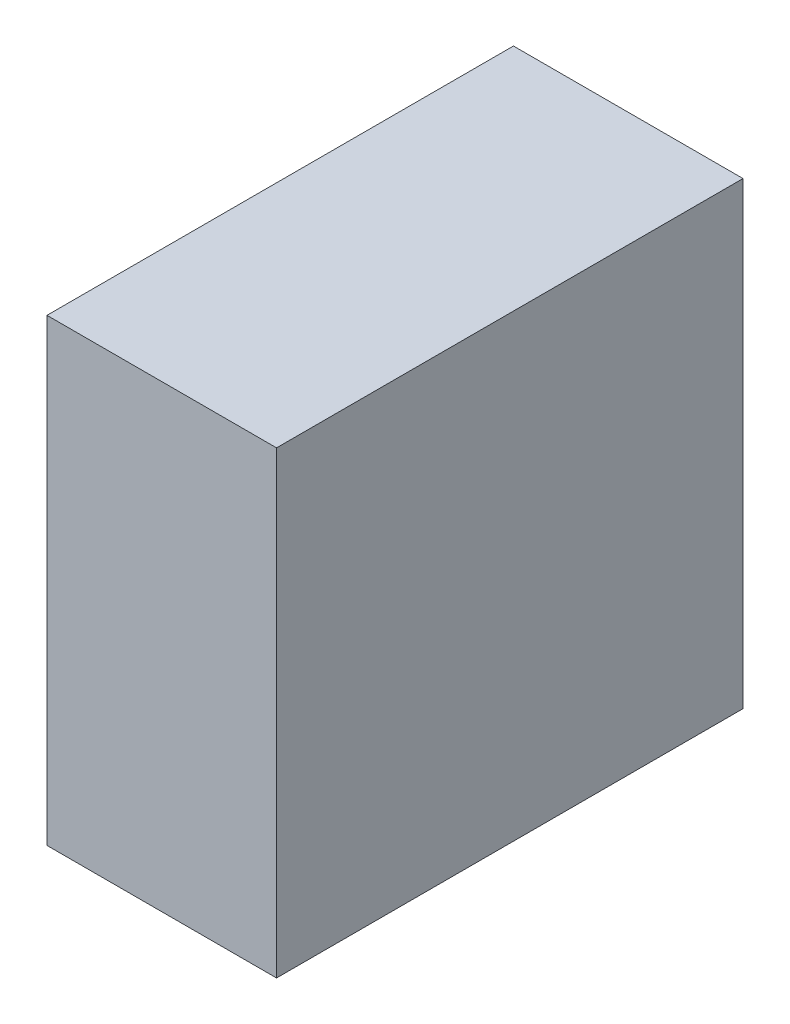
ISO-10303-21;
HEADER;
FILE_DESCRIPTION(('STEP AP214'),'2;1');
FILE_NAME('part.step','',(''),(''),'','','');
FILE_SCHEMA(('AUTOMOTIVE_DESIGN { 1 0 10303 214 1 1 1 1 }'));
ENDSEC;
DATA;
#1=APPLICATION_CONTEXT('core data for automotive mechanical design processes');
#2=APPLICATION_PROTOCOL_DEFINITION('international standard','automotive_design',2000,#1);
#3=PRODUCT_CONTEXT('',#1,'mechanical');
#4=PRODUCT('Part','Part','',(#3));
#5=PRODUCT_RELATED_PRODUCT_CATEGORY('part','',(#4));
#6=PRODUCT_DEFINITION_FORMATION('','',#4);
#7=PRODUCT_DEFINITION_CONTEXT('part definition',#1,'design');
#8=PRODUCT_DEFINITION('design','',#6,#7);
#9=PRODUCT_DEFINITION_SHAPE('','',#8);
#10=(LENGTH_UNIT() NAMED_UNIT(*) SI_UNIT(.MILLI.,.METRE.));
#11=(NAMED_UNIT(*) PLANE_ANGLE_UNIT() SI_UNIT($,.RADIAN.));
#12=(NAMED_UNIT(*) SI_UNIT($,.STERADIAN.) SOLID_ANGLE_UNIT());
#13=UNCERTAINTY_MEASURE_WITH_UNIT(LENGTH_MEASURE(1.E-05),#10,'distance_accuracy_value','');
#14=(GEOMETRIC_REPRESENTATION_CONTEXT(3) GLOBAL_UNCERTAINTY_ASSIGNED_CONTEXT((#13)) GLOBAL_UNIT_ASSIGNED_CONTEXT((#10,
#11,#12)) REPRESENTATION_CONTEXT('',''));
#15=CARTESIAN_POINT('',(0.,0.,0.));
#16=DIRECTION('',(0.,0.,1.));
#17=DIRECTION('',(1.,0.,0.));
#18=AXIS2_PLACEMENT_3D('',#15,#16,#17);
#19=CARTESIAN_POINT('',(-100.,100.,203.2));
#20=DIRECTION('',(1.,0.,0.));
#21=DIRECTION('',(0.,0.,-1.));
#22=AXIS2_PLACEMENT_3D('',#19,#20,#21);
#23=PLANE('',#22);
#24=DIRECTION('',(0.,-1.,0.));
#25=VECTOR('',#24,1.);
#26=CARTESIAN_POINT('',(-100.,100.,0.));
#27=LINE('',#26,#25);
#28=CARTESIAN_POINT('',(-100.,100.,0.));
#29=VERTEX_POINT('',#28);
#30=CARTESIAN_POINT('',(-100.,-100.,0.));
#31=VERTEX_POINT('',#30);
#32=EDGE_CURVE('E102',#29,#31,#27,.T.);
#33=ORIENTED_EDGE('',*,*,#32,.T.);
#34=DIRECTION('',(0.,0.,-1.));
#35=VECTOR('',#34,1.);
#36=CARTESIAN_POINT('',(-100.,-100.,203.2));
#37=LINE('',#36,#35);
#38=CARTESIAN_POINT('',(-100.,-100.,203.2));
#39=VERTEX_POINT('',#38);
#40=EDGE_CURVE('E11',#39,#31,#37,.T.);
#41=ORIENTED_EDGE('',*,*,#40,.F.);
#42=DIRECTION('',(0.,-1.,0.));
#43=VECTOR('',#42,1.);
#44=CARTESIAN_POINT('',(-100.,100.,203.2));
#45=LINE('',#44,#43);
#46=CARTESIAN_POINT('',(-100.,100.,203.2));
#47=VERTEX_POINT('',#46);
#48=EDGE_CURVE('E88',#47,#39,#45,.T.);
#49=ORIENTED_EDGE('',*,*,#48,.F.);
#50=DIRECTION('',(0.,0.,-1.));
#51=VECTOR('',#50,1.);
#52=CARTESIAN_POINT('',(-100.,100.,203.2));
#53=LINE('',#52,#51);
#54=EDGE_CURVE('E55',#47,#29,#53,.T.);
#55=ORIENTED_EDGE('',*,*,#54,.T.);
#56=EDGE_LOOP('',(#33,#41,#49,#55));
#57=FACE_BOUND('',#56,.T.);
#58=ADVANCED_FACE('F39',(#57),#23,.F.);
#59=CARTESIAN_POINT('',(-100.,-100.,203.2));
#60=DIRECTION('',(0.,1.,0.));
#61=DIRECTION('',(-1.,0.,0.));
#62=AXIS2_PLACEMENT_3D('',#59,#60,#61);
#63=PLANE('',#62);
#64=DIRECTION('',(1.,0.,0.));
#65=VECTOR('',#64,1.);
#66=CARTESIAN_POINT('',(-100.,-100.,0.));
#67=LINE('',#66,#65);
#68=CARTESIAN_POINT('',(0.,-100.,0.));
#69=VERTEX_POINT('',#68);
#70=EDGE_CURVE('E93',#31,#69,#67,.T.);
#71=ORIENTED_EDGE('',*,*,#70,.T.);
#72=DIRECTION('',(0.,0.,-1.));
#73=VECTOR('',#72,1.);
#74=CARTESIAN_POINT('',(0.,-100.,203.2));
#75=LINE('',#74,#73);
#76=CARTESIAN_POINT('',(0.,-100.,203.2));
#77=VERTEX_POINT('',#76);
#78=EDGE_CURVE('E47',#77,#69,#75,.T.);
#79=ORIENTED_EDGE('',*,*,#78,.F.);
#80=DIRECTION('',(1.,0.,0.));
#81=VECTOR('',#80,1.);
#82=CARTESIAN_POINT('',(-100.,-100.,203.2));
#83=LINE('',#82,#81);
#84=EDGE_CURVE('E80',#39,#77,#83,.T.);
#85=ORIENTED_EDGE('',*,*,#84,.F.);
#86=ORIENTED_EDGE('',*,*,#40,.T.);
#87=EDGE_LOOP('',(#71,#79,#85,#86));
#88=FACE_BOUND('',#87,.T.);
#89=ADVANCED_FACE('F92',(#88),#63,.F.);
#90=CARTESIAN_POINT('',(0.,100.,203.2));
#91=DIRECTION('',(1.,0.,0.));
#92=DIRECTION('',(0.,0.,-1.));
#93=AXIS2_PLACEMENT_3D('',#90,#91,#92);
#94=PLANE('',#93);
#95=DIRECTION('',(0.,-1.,0.));
#96=VECTOR('',#95,1.);
#97=CARTESIAN_POINT('',(0.,100.,0.));
#98=LINE('',#97,#96);
#99=CARTESIAN_POINT('',(0.,100.,0.));
#100=VERTEX_POINT('',#99);
#101=EDGE_CURVE('E105',#100,#69,#98,.T.);
#102=ORIENTED_EDGE('',*,*,#101,.F.);
#103=DIRECTION('',(0.,0.,-1.));
#104=VECTOR('',#103,1.);
#105=CARTESIAN_POINT('',(0.,100.,203.2));
#106=LINE('',#105,#104);
#107=CARTESIAN_POINT('',(0.,100.,203.2));
#108=VERTEX_POINT('',#107);
#109=EDGE_CURVE('E69',#108,#100,#106,.T.);
#110=ORIENTED_EDGE('',*,*,#109,.F.);
#111=DIRECTION('',(0.,-1.,0.));
#112=VECTOR('',#111,1.);
#113=CARTESIAN_POINT('',(0.,100.,203.2));
#114=LINE('',#113,#112);
#115=EDGE_CURVE('E87',#108,#77,#114,.T.);
#116=ORIENTED_EDGE('',*,*,#115,.T.);
#117=ORIENTED_EDGE('',*,*,#78,.T.);
#118=EDGE_LOOP('',(#102,#110,#116,#117));
#119=FACE_BOUND('',#118,.T.);
#120=ADVANCED_FACE('F96',(#119),#94,.T.);
#121=CARTESIAN_POINT('',(-100.,100.,203.2));
#122=DIRECTION('',(0.,1.,0.));
#123=DIRECTION('',(-1.,0.,0.));
#124=AXIS2_PLACEMENT_3D('',#121,#122,#123);
#125=PLANE('',#124);
#126=DIRECTION('',(1.,0.,0.));
#127=VECTOR('',#126,1.);
#128=CARTESIAN_POINT('',(-100.,100.,0.));
#129=LINE('',#128,#127);
#130=EDGE_CURVE('E107',#29,#100,#129,.T.);
#131=ORIENTED_EDGE('',*,*,#130,.F.);
#132=ORIENTED_EDGE('',*,*,#54,.F.);
#133=DIRECTION('',(1.,0.,0.));
#134=VECTOR('',#133,1.);
#135=CARTESIAN_POINT('',(-100.,100.,203.2));
#136=LINE('',#135,#134);
#137=EDGE_CURVE('E97',#47,#108,#136,.T.);
#138=ORIENTED_EDGE('',*,*,#137,.T.);
#139=ORIENTED_EDGE('',*,*,#109,.T.);
#140=EDGE_LOOP('',(#131,#132,#138,#139));
#141=FACE_BOUND('',#140,.T.);
#142=ADVANCED_FACE('F113',(#141),#125,.T.);
#143=CARTESIAN_POINT('',(0.,0.,203.2));
#144=DIRECTION('',(0.,0.,1.));
#145=DIRECTION('',(1.,0.,0.));
#146=AXIS2_PLACEMENT_3D('',#143,#144,#145);
#147=PLANE('',#146);
#148=ORIENTED_EDGE('',*,*,#48,.T.);
#149=ORIENTED_EDGE('',*,*,#84,.T.);
#150=ORIENTED_EDGE('',*,*,#115,.F.);
#151=ORIENTED_EDGE('',*,*,#137,.F.);
#152=EDGE_LOOP('',(#148,#149,#150,#151));
#153=FACE_BOUND('',#152,.T.);
#154=ADVANCED_FACE('F84',(#153),#147,.T.);
#155=CARTESIAN_POINT('',(0.,0.,0.));
#156=DIRECTION('',(0.,0.,1.));
#157=DIRECTION('',(1.,0.,0.));
#158=AXIS2_PLACEMENT_3D('',#155,#156,#157);
#159=PLANE('',#158);
#160=ORIENTED_EDGE('',*,*,#32,.F.);
#161=ORIENTED_EDGE('',*,*,#130,.T.);
#162=ORIENTED_EDGE('',*,*,#101,.T.);
#163=ORIENTED_EDGE('',*,*,#70,.F.);
#164=EDGE_LOOP('',(#160,#161,#162,#163));
#165=FACE_BOUND('',#164,.T.);
#166=ADVANCED_FACE('F112',(#165),#159,.F.);
#167=CLOSED_SHELL('',(#58,#89,#120,#142,#154,#166));
#168=MANIFOLD_SOLID_BREP('B2',#167);
#169=ADVANCED_BREP_SHAPE_REPRESENTATION('',(#18,#168),#14);
#170=SHAPE_DEFINITION_REPRESENTATION(#9,#169);
ENDSEC;
END-ISO-10303-21;
